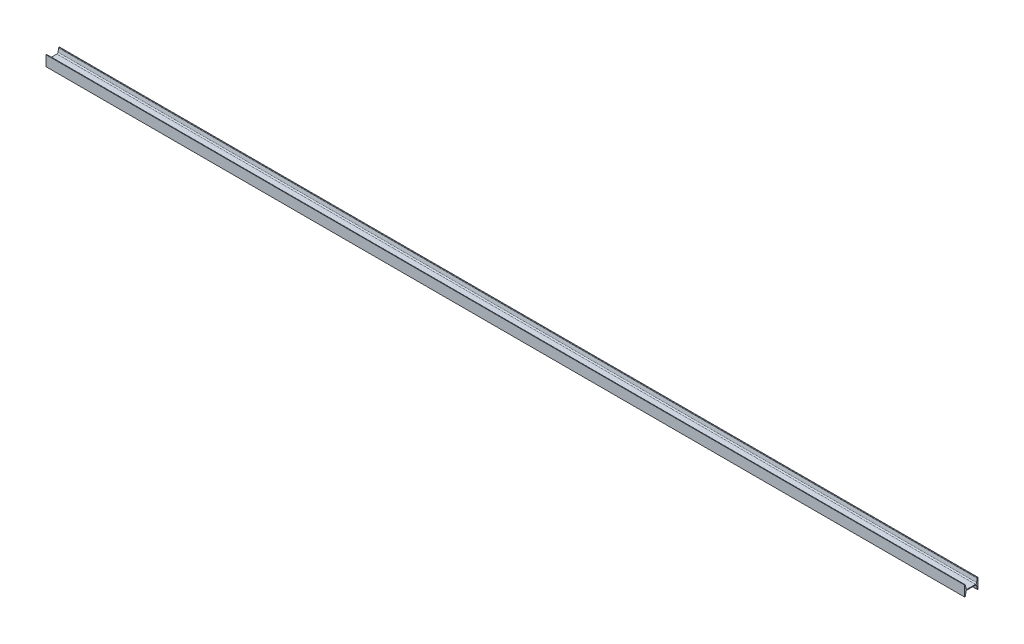
ISO-10303-21;
HEADER;
FILE_DESCRIPTION(('STEP AP214'),'2;1');
FILE_NAME('part.step','',(''),(''),'','','');
FILE_SCHEMA(('AUTOMOTIVE_DESIGN { 1 0 10303 214 1 1 1 1 }'));
ENDSEC;
DATA;
#1=APPLICATION_CONTEXT('core data for automotive mechanical design processes');
#2=APPLICATION_PROTOCOL_DEFINITION('international standard','automotive_design',2000,#1);
#3=PRODUCT_CONTEXT('',#1,'mechanical');
#4=PRODUCT('Part','Part','',(#3));
#5=PRODUCT_RELATED_PRODUCT_CATEGORY('part','',(#4));
#6=PRODUCT_DEFINITION_FORMATION('','',#4);
#7=PRODUCT_DEFINITION_CONTEXT('part definition',#1,'design');
#8=PRODUCT_DEFINITION('design','',#6,#7);
#9=PRODUCT_DEFINITION_SHAPE('','',#8);
#10=(LENGTH_UNIT() NAMED_UNIT(*) SI_UNIT(.MILLI.,.METRE.));
#11=(NAMED_UNIT(*) PLANE_ANGLE_UNIT() SI_UNIT($,.RADIAN.));
#12=(NAMED_UNIT(*) SI_UNIT($,.STERADIAN.) SOLID_ANGLE_UNIT());
#13=UNCERTAINTY_MEASURE_WITH_UNIT(LENGTH_MEASURE(1.E-05),#10,'distance_accuracy_value','');
#14=(GEOMETRIC_REPRESENTATION_CONTEXT(3) GLOBAL_UNCERTAINTY_ASSIGNED_CONTEXT((#13)) GLOBAL_UNIT_ASSIGNED_CONTEXT((#10,
#11,#12)) REPRESENTATION_CONTEXT('',''));
#15=CARTESIAN_POINT('',(0.,0.,0.));
#16=DIRECTION('',(0.,0.,1.));
#17=DIRECTION('',(1.,0.,0.));
#18=AXIS2_PLACEMENT_3D('',#15,#16,#17);
#19=CARTESIAN_POINT('',(3076.96600985222,136.72769950739,-38.1));
#20=DIRECTION('',(0.,0.,1.));
#21=DIRECTION('',(0.,-1.,0.));
#22=AXIS2_PLACEMENT_3D('',#19,#20,#21);
#23=PLANE('',#22);
#24=DIRECTION('',(0.,1.,0.));
#25=VECTOR('',#24,1.);
#26=CARTESIAN_POINT('',(-2142.73399014778,136.72769950739,-38.1));
#27=LINE('',#26,#25);
#28=CARTESIAN_POINT('',(-2142.73399014778,77.5456995073895,-38.1));
#29=VERTEX_POINT('',#28);
#30=CARTESIAN_POINT('',(-2142.73399014778,136.72769950739,-38.1));
#31=VERTEX_POINT('',#30);
#32=EDGE_CURVE('E268',#29,#31,#27,.T.);
#33=ORIENTED_EDGE('',*,*,#32,.T.);
#34=DIRECTION('',(-1.,0.,0.));
#35=VECTOR('',#34,1.);
#36=CARTESIAN_POINT('',(3076.96600985222,136.72769950739,-38.1));
#37=LINE('',#36,#35);
#38=CARTESIAN_POINT('',(3076.96600985222,136.72769950739,-38.1));
#39=VERTEX_POINT('',#38);
#40=EDGE_CURVE('E13',#39,#31,#37,.T.);
#41=ORIENTED_EDGE('',*,*,#40,.F.);
#42=DIRECTION('',(0.,1.,0.));
#43=VECTOR('',#42,1.);
#44=CARTESIAN_POINT('',(3076.96600985222,136.72769950739,-38.1));
#45=LINE('',#44,#43);
#46=CARTESIAN_POINT('',(3076.96600985222,77.5456995073895,-38.1));
#47=VERTEX_POINT('',#46);
#48=EDGE_CURVE('E306',#47,#39,#45,.T.);
#49=ORIENTED_EDGE('',*,*,#48,.F.);
#50=DIRECTION('',(-1.,0.,0.));
#51=VECTOR('',#50,1.);
#52=CARTESIAN_POINT('',(3076.96600985222,77.5456995073895,-38.1));
#53=LINE('',#52,#51);
#54=EDGE_CURVE('E264',#47,#29,#53,.T.);
#55=ORIENTED_EDGE('',*,*,#54,.T.);
#56=EDGE_LOOP('',(#33,#41,#49,#55));
#57=FACE_BOUND('',#56,.T.);
#58=ADVANCED_FACE('F100',(#57),#23,.F.);
#59=CARTESIAN_POINT('',(3076.96600985222,136.72769950739,-35.933843762969));
#60=DIRECTION('',(0.,-1.,0.));
#61=DIRECTION('',(0.,0.,-1.));
#62=AXIS2_PLACEMENT_3D('',#59,#60,#61);
#63=PLANE('',#62);
#64=DIRECTION('',(0.,0.,1.));
#65=VECTOR('',#64,1.);
#66=CARTESIAN_POINT('',(-2142.73399014778,136.72769950739,-35.933843762969));
#67=LINE('',#66,#65);
#68=CARTESIAN_POINT('',(-2142.73399014778,136.72769950739,-35.933843762969));
#69=VERTEX_POINT('',#68);
#70=EDGE_CURVE('E271',#31,#69,#67,.T.);
#71=ORIENTED_EDGE('',*,*,#70,.T.);
#72=DIRECTION('',(-1.,0.,0.));
#73=VECTOR('',#72,1.);
#74=CARTESIAN_POINT('',(3076.96600985222,136.72769950739,-35.933843762969));
#75=LINE('',#74,#73);
#76=CARTESIAN_POINT('',(3076.96600985222,136.72769950739,-35.933843762969));
#77=VERTEX_POINT('',#76);
#78=EDGE_CURVE('E108',#77,#69,#75,.T.);
#79=ORIENTED_EDGE('',*,*,#78,.F.);
#80=DIRECTION('',(0.,0.,1.));
#81=VECTOR('',#80,1.);
#82=CARTESIAN_POINT('',(3076.96600985222,136.72769950739,-35.933843762969));
#83=LINE('',#82,#81);
#84=EDGE_CURVE('E195',#39,#77,#83,.T.);
#85=ORIENTED_EDGE('',*,*,#84,.F.);
#86=ORIENTED_EDGE('',*,*,#40,.T.);
#87=EDGE_LOOP('',(#71,#79,#85,#86));
#88=FACE_BOUND('',#87,.T.);
#89=ADVANCED_FACE('F424',(#88),#63,.F.);
#90=CARTESIAN_POINT('',(3076.96600985222,134.18769950739,-35.9338437629689));
#91=DIRECTION('',(-1.,0.,0.));
#92=DIRECTION('',(0.,0.,1.));
#93=AXIS2_PLACEMENT_3D('',#90,#91,#92);
#94=CYLINDRICAL_SURFACE('',#93,2.54000000000001);
#95=CARTESIAN_POINT('',(-2142.73399014778,134.18769950739,-35.9338437629689));
#96=DIRECTION('',(1.,0.,0.));
#97=DIRECTION('',(0.,0.,-1.));
#98=AXIS2_PLACEMENT_3D('',#95,#96,#97);
#99=CIRCLE('',#98,2.54000000000001);
#100=CARTESIAN_POINT('',(-2142.73399014778,134.60530257373,-33.4284081363796));
#101=VERTEX_POINT('',#100);
#102=EDGE_CURVE('E273',#69,#101,#99,.T.);
#103=ORIENTED_EDGE('',*,*,#102,.T.);
#104=DIRECTION('',(-1.,0.,0.));
#105=VECTOR('',#104,1.);
#106=CARTESIAN_POINT('',(3076.96600985222,134.60530257373,-33.4284081363796));
#107=LINE('',#106,#105);
#108=CARTESIAN_POINT('',(3076.96600985222,134.60530257373,-33.4284081363796));
#109=VERTEX_POINT('',#108);
#110=EDGE_CURVE('E349',#109,#101,#107,.T.);
#111=ORIENTED_EDGE('',*,*,#110,.F.);
#112=CARTESIAN_POINT('',(3076.96600985222,134.18769950739,-35.9338437629689));
#113=DIRECTION('',(1.,0.,0.));
#114=DIRECTION('',(0.,0.,-1.));
#115=AXIS2_PLACEMENT_3D('',#112,#113,#114);
#116=CIRCLE('',#115,2.54000000000001);
#117=EDGE_CURVE('E357',#77,#109,#116,.T.);
#118=ORIENTED_EDGE('',*,*,#117,.F.);
#119=ORIENTED_EDGE('',*,*,#78,.T.);
#120=EDGE_LOOP('',(#103,#111,#118,#119));
#121=FACE_BOUND('',#120,.T.);
#122=ADVANCED_FACE('F355',(#121),#94,.T.);
#123=CARTESIAN_POINT('',(3076.96600985222,115.02617122827,-30.1649815292945));
#124=DIRECTION('',(0.,-0.164410656039623,-0.986391978972163));
#125=DIRECTION('',(0.,0.986391978972163,-0.164410656039623));
#126=AXIS2_PLACEMENT_3D('',#123,#124,#125);
#127=PLANE('',#126);
#128=DIRECTION('',(0.,-0.986391978972163,0.164410656039623));
#129=VECTOR('',#128,1.);
#130=CARTESIAN_POINT('',(-2142.73399014778,115.02617122827,-30.1649815292945));
#131=LINE('',#130,#129);
#132=CARTESIAN_POINT('',(-2142.73399014778,115.02617122827,-30.1649815292945));
#133=VERTEX_POINT('',#132);
#134=EDGE_CURVE('E275',#101,#133,#131,.T.);
#135=ORIENTED_EDGE('',*,*,#134,.T.);
#136=DIRECTION('',(-1.,0.,0.));
#137=VECTOR('',#136,1.);
#138=CARTESIAN_POINT('',(3076.96600985222,115.02617122827,-30.1649815292945));
#139=LINE('',#138,#137);
#140=CARTESIAN_POINT('',(3076.96600985222,115.02617122827,-30.1649815292945));
#141=VERTEX_POINT('',#140);
#142=EDGE_CURVE('E346',#141,#133,#139,.T.);
#143=ORIENTED_EDGE('',*,*,#142,.F.);
#144=DIRECTION('',(0.,-0.986391978972163,0.164410656039623));
#145=VECTOR('',#144,1.);
#146=CARTESIAN_POINT('',(3076.96600985222,115.02617122827,-30.1649815292945));
#147=LINE('',#146,#145);
#148=EDGE_CURVE('E375',#109,#141,#147,.T.);
#149=ORIENTED_EDGE('',*,*,#148,.F.);
#150=ORIENTED_EDGE('',*,*,#110,.T.);
#151=EDGE_LOOP('',(#135,#143,#149,#150));
#152=FACE_BOUND('',#151,.T.);
#153=ADVANCED_FACE('F366',(#152),#127,.F.);
#154=CARTESIAN_POINT('',(3076.96600985222,116.15369950739,-23.4003053375034));
#155=DIRECTION('',(-1.,0.,0.));
#156=DIRECTION('',(0.,0.,1.));
#157=AXIS2_PLACEMENT_3D('',#154,#155,#156);
#158=CYLINDRICAL_SURFACE('',#157,6.858);
#159=CARTESIAN_POINT('',(-2142.73399014778,116.15369950739,-23.4003053375034));
#160=DIRECTION('',(-1.,0.,0.));
#161=DIRECTION('',(0.,0.,-1.));
#162=AXIS2_PLACEMENT_3D('',#159,#160,#161);
#163=CIRCLE('',#162,6.858);
#164=CARTESIAN_POINT('',(-2142.73399014778,109.29569950739,-23.4003053375034));
#165=VERTEX_POINT('',#164);
#166=EDGE_CURVE('E277',#133,#165,#163,.T.);
#167=ORIENTED_EDGE('',*,*,#166,.T.);
#168=DIRECTION('',(-1.,0.,0.));
#169=VECTOR('',#168,1.);
#170=CARTESIAN_POINT('',(3076.96600985222,109.29569950739,-23.4003053375034));
#171=LINE('',#170,#169);
#172=CARTESIAN_POINT('',(3076.96600985222,109.29569950739,-23.4003053375034));
#173=VERTEX_POINT('',#172);
#174=EDGE_CURVE('E343',#173,#165,#171,.T.);
#175=ORIENTED_EDGE('',*,*,#174,.F.);
#176=CARTESIAN_POINT('',(3076.96600985222,116.15369950739,-23.4003053375034));
#177=DIRECTION('',(-1.,0.,0.));
#178=DIRECTION('',(0.,0.,-1.));
#179=AXIS2_PLACEMENT_3D('',#176,#177,#178);
#180=CIRCLE('',#179,6.858);
#181=EDGE_CURVE('E372',#141,#173,#180,.T.);
#182=ORIENTED_EDGE('',*,*,#181,.F.);
#183=ORIENTED_EDGE('',*,*,#142,.T.);
#184=EDGE_LOOP('',(#167,#175,#182,#183));
#185=FACE_BOUND('',#184,.T.);
#186=ADVANCED_FACE('F370',(#185),#158,.F.);
#187=CARTESIAN_POINT('',(3076.96600985222,109.29569950739,23.4003053375034));
#188=DIRECTION('',(0.,-1.,0.));
#189=DIRECTION('',(0.,0.,-1.));
#190=AXIS2_PLACEMENT_3D('',#187,#188,#189);
#191=PLANE('',#190);
#192=DIRECTION('',(0.,0.,1.));
#193=VECTOR('',#192,1.);
#194=CARTESIAN_POINT('',(-2142.73399014778,109.29569950739,23.4003053375034));
#195=LINE('',#194,#193);
#196=CARTESIAN_POINT('',(-2142.73399014778,109.29569950739,23.4003053375034));
#197=VERTEX_POINT('',#196);
#198=EDGE_CURVE('E279',#165,#197,#195,.T.);
#199=ORIENTED_EDGE('',*,*,#198,.T.);
#200=DIRECTION('',(-1.,0.,0.));
#201=VECTOR('',#200,1.);
#202=CARTESIAN_POINT('',(3076.96600985222,109.29569950739,23.4003053375034));
#203=LINE('',#202,#201);
#204=CARTESIAN_POINT('',(3076.96600985222,109.29569950739,23.4003053375034));
#205=VERTEX_POINT('',#204);
#206=EDGE_CURVE('E340',#205,#197,#203,.T.);
#207=ORIENTED_EDGE('',*,*,#206,.F.);
#208=DIRECTION('',(0.,0.,1.));
#209=VECTOR('',#208,1.);
#210=CARTESIAN_POINT('',(3076.96600985222,109.29569950739,23.4003053375034));
#211=LINE('',#210,#209);
#212=EDGE_CURVE('E374',#173,#205,#211,.T.);
#213=ORIENTED_EDGE('',*,*,#212,.F.);
#214=ORIENTED_EDGE('',*,*,#174,.T.);
#215=EDGE_LOOP('',(#199,#207,#213,#214));
#216=FACE_BOUND('',#215,.T.);
#217=ADVANCED_FACE('F437',(#216),#191,.F.);
#218=CARTESIAN_POINT('',(3076.96600985222,116.15369950739,23.4003053375034));
#219=DIRECTION('',(-1.,0.,0.));
#220=DIRECTION('',(0.,0.,1.));
#221=AXIS2_PLACEMENT_3D('',#218,#219,#220);
#222=CYLINDRICAL_SURFACE('',#221,6.858);
#223=CARTESIAN_POINT('',(-2142.73399014778,116.15369950739,23.4003053375034));
#224=DIRECTION('',(-1.,0.,0.));
#225=DIRECTION('',(0.,0.,-1.));
#226=AXIS2_PLACEMENT_3D('',#223,#224,#225);
#227=CIRCLE('',#226,6.858);
#228=CARTESIAN_POINT('',(-2142.73399014778,115.02617122827,30.1649815292945));
#229=VERTEX_POINT('',#228);
#230=EDGE_CURVE('E281',#197,#229,#227,.T.);
#231=ORIENTED_EDGE('',*,*,#230,.T.);
#232=DIRECTION('',(-1.,0.,0.));
#233=VECTOR('',#232,1.);
#234=CARTESIAN_POINT('',(3076.96600985222,115.02617122827,30.1649815292945));
#235=LINE('',#234,#233);
#236=CARTESIAN_POINT('',(3076.96600985222,115.02617122827,30.1649815292945));
#237=VERTEX_POINT('',#236);
#238=EDGE_CURVE('E337',#237,#229,#235,.T.);
#239=ORIENTED_EDGE('',*,*,#238,.F.);
#240=CARTESIAN_POINT('',(3076.96600985222,116.15369950739,23.4003053375034));
#241=DIRECTION('',(-1.,0.,0.));
#242=DIRECTION('',(0.,0.,-1.));
#243=AXIS2_PLACEMENT_3D('',#240,#241,#242);
#244=CIRCLE('',#243,6.858);
#245=EDGE_CURVE('E377',#205,#237,#244,.T.);
#246=ORIENTED_EDGE('',*,*,#245,.F.);
#247=ORIENTED_EDGE('',*,*,#206,.T.);
#248=EDGE_LOOP('',(#231,#239,#246,#247));
#249=FACE_BOUND('',#248,.T.);
#250=ADVANCED_FACE('F440',(#249),#222,.F.);
#251=CARTESIAN_POINT('',(3076.96600985222,134.60530257373,33.4284081363796));
#252=DIRECTION('',(0.,-0.164410656039623,0.986391978972163));
#253=DIRECTION('',(0.,-0.986391978972163,-0.164410656039623));
#254=AXIS2_PLACEMENT_3D('',#251,#252,#253);
#255=PLANE('',#254);
#256=DIRECTION('',(0.,0.986391978972163,0.164410656039623));
#257=VECTOR('',#256,1.);
#258=CARTESIAN_POINT('',(-2142.73399014778,134.60530257373,33.4284081363796));
#259=LINE('',#258,#257);
#260=CARTESIAN_POINT('',(-2142.73399014778,134.60530257373,33.4284081363796));
#261=VERTEX_POINT('',#260);
#262=EDGE_CURVE('E283',#229,#261,#259,.T.);
#263=ORIENTED_EDGE('',*,*,#262,.T.);
#264=DIRECTION('',(-1.,0.,0.));
#265=VECTOR('',#264,1.);
#266=CARTESIAN_POINT('',(3076.96600985222,134.60530257373,33.4284081363796));
#267=LINE('',#266,#265);
#268=CARTESIAN_POINT('',(3076.96600985222,134.60530257373,33.4284081363796));
#269=VERTEX_POINT('',#268);
#270=EDGE_CURVE('E334',#269,#261,#267,.T.);
#271=ORIENTED_EDGE('',*,*,#270,.F.);
#272=DIRECTION('',(0.,0.986391978972163,0.164410656039623));
#273=VECTOR('',#272,1.);
#274=CARTESIAN_POINT('',(3076.96600985222,134.60530257373,33.4284081363796));
#275=LINE('',#274,#273);
#276=EDGE_CURVE('E383',#237,#269,#275,.T.);
#277=ORIENTED_EDGE('',*,*,#276,.F.);
#278=ORIENTED_EDGE('',*,*,#238,.T.);
#279=EDGE_LOOP('',(#263,#271,#277,#278));
#280=FACE_BOUND('',#279,.T.);
#281=ADVANCED_FACE('F444',(#280),#255,.F.);
#282=CARTESIAN_POINT('',(3076.96600985222,134.18769950739,35.9338437629689));
#283=DIRECTION('',(-1.,0.,0.));
#284=DIRECTION('',(0.,0.,1.));
#285=AXIS2_PLACEMENT_3D('',#282,#283,#284);
#286=CYLINDRICAL_SURFACE('',#285,2.54000000000001);
#287=CARTESIAN_POINT('',(-2142.73399014778,134.18769950739,35.9338437629689));
#288=DIRECTION('',(1.,0.,0.));
#289=DIRECTION('',(0.,0.,-1.));
#290=AXIS2_PLACEMENT_3D('',#287,#288,#289);
#291=CIRCLE('',#290,2.54000000000001);
#292=CARTESIAN_POINT('',(-2142.73399014778,136.72769950739,35.9338437629689));
#293=VERTEX_POINT('',#292);
#294=EDGE_CURVE('E285',#261,#293,#291,.T.);
#295=ORIENTED_EDGE('',*,*,#294,.T.);
#296=DIRECTION('',(-1.,0.,0.));
#297=VECTOR('',#296,1.);
#298=CARTESIAN_POINT('',(3076.96600985222,136.72769950739,35.9338437629689));
#299=LINE('',#298,#297);
#300=CARTESIAN_POINT('',(3076.96600985222,136.72769950739,35.9338437629689));
#301=VERTEX_POINT('',#300);
#302=EDGE_CURVE('E331',#301,#293,#299,.T.);
#303=ORIENTED_EDGE('',*,*,#302,.F.);
#304=CARTESIAN_POINT('',(3076.96600985222,134.18769950739,35.9338437629689));
#305=DIRECTION('',(1.,0.,0.));
#306=DIRECTION('',(0.,0.,-1.));
#307=AXIS2_PLACEMENT_3D('',#304,#305,#306);
#308=CIRCLE('',#307,2.54000000000001);
#309=EDGE_CURVE('E385',#269,#301,#308,.T.);
#310=ORIENTED_EDGE('',*,*,#309,.F.);
#311=ORIENTED_EDGE('',*,*,#270,.T.);
#312=EDGE_LOOP('',(#295,#303,#310,#311));
#313=FACE_BOUND('',#312,.T.);
#314=ADVANCED_FACE('F448',(#313),#286,.T.);
#315=CARTESIAN_POINT('',(3076.96600985222,136.72769950739,38.1));
#316=DIRECTION('',(0.,-1.,0.));
#317=DIRECTION('',(0.,0.,-1.));
#318=AXIS2_PLACEMENT_3D('',#315,#316,#317);
#319=PLANE('',#318);
#320=DIRECTION('',(0.,0.,1.));
#321=VECTOR('',#320,1.);
#322=CARTESIAN_POINT('',(-2142.73399014778,136.72769950739,38.1));
#323=LINE('',#322,#321);
#324=CARTESIAN_POINT('',(-2142.73399014778,136.72769950739,38.1));
#325=VERTEX_POINT('',#324);
#326=EDGE_CURVE('E287',#293,#325,#323,.T.);
#327=ORIENTED_EDGE('',*,*,#326,.T.);
#328=DIRECTION('',(-1.,0.,0.));
#329=VECTOR('',#328,1.);
#330=CARTESIAN_POINT('',(3076.96600985222,136.72769950739,38.1));
#331=LINE('',#330,#329);
#332=CARTESIAN_POINT('',(3076.96600985222,136.72769950739,38.1));
#333=VERTEX_POINT('',#332);
#334=EDGE_CURVE('E328',#333,#325,#331,.T.);
#335=ORIENTED_EDGE('',*,*,#334,.F.);
#336=DIRECTION('',(0.,0.,1.));
#337=VECTOR('',#336,1.);
#338=CARTESIAN_POINT('',(3076.96600985222,136.72769950739,38.1));
#339=LINE('',#338,#337);
#340=EDGE_CURVE('E387',#301,#333,#339,.T.);
#341=ORIENTED_EDGE('',*,*,#340,.F.);
#342=ORIENTED_EDGE('',*,*,#302,.T.);
#343=EDGE_LOOP('',(#327,#335,#341,#342));
#344=FACE_BOUND('',#343,.T.);
#345=ADVANCED_FACE('F452',(#344),#319,.F.);
#346=CARTESIAN_POINT('',(3076.96600985222,77.5456995073895,38.1));
#347=DIRECTION('',(0.,0.,-1.));
#348=DIRECTION('',(0.,1.,0.));
#349=AXIS2_PLACEMENT_3D('',#346,#347,#348);
#350=PLANE('',#349);
#351=DIRECTION('',(0.,-1.,0.));
#352=VECTOR('',#351,1.);
#353=CARTESIAN_POINT('',(-2142.73399014778,77.5456995073895,38.1));
#354=LINE('',#353,#352);
#355=CARTESIAN_POINT('',(-2142.73399014778,77.5456995073895,38.1));
#356=VERTEX_POINT('',#355);
#357=EDGE_CURVE('E289',#325,#356,#354,.T.);
#358=ORIENTED_EDGE('',*,*,#357,.T.);
#359=DIRECTION('',(-1.,0.,0.));
#360=VECTOR('',#359,1.);
#361=CARTESIAN_POINT('',(3076.96600985222,77.5456995073895,38.1));
#362=LINE('',#361,#360);
#363=CARTESIAN_POINT('',(3076.96600985222,77.5456995073895,38.1));
#364=VERTEX_POINT('',#363);
#365=EDGE_CURVE('E325',#364,#356,#362,.T.);
#366=ORIENTED_EDGE('',*,*,#365,.F.);
#367=DIRECTION('',(0.,-1.,0.));
#368=VECTOR('',#367,1.);
#369=CARTESIAN_POINT('',(3076.96600985222,77.5456995073895,38.1));
#370=LINE('',#369,#368);
#371=EDGE_CURVE('E389',#333,#364,#370,.T.);
#372=ORIENTED_EDGE('',*,*,#371,.F.);
#373=ORIENTED_EDGE('',*,*,#334,.T.);
#374=EDGE_LOOP('',(#358,#366,#372,#373));
#375=FACE_BOUND('',#374,.T.);
#376=ADVANCED_FACE('F456',(#375),#350,.F.);
#377=CARTESIAN_POINT('',(3076.96600985222,77.5456995073895,35.9338437629689));
#378=DIRECTION('',(0.,1.,0.));
#379=DIRECTION('',(0.,0.,1.));
#380=AXIS2_PLACEMENT_3D('',#377,#378,#379);
#381=PLANE('',#380);
#382=DIRECTION('',(0.,0.,-1.));
#383=VECTOR('',#382,1.);
#384=CARTESIAN_POINT('',(-2142.73399014778,77.5456995073895,35.9338437629689));
#385=LINE('',#384,#383);
#386=CARTESIAN_POINT('',(-2142.73399014778,77.5456995073895,35.9338437629689));
#387=VERTEX_POINT('',#386);
#388=EDGE_CURVE('E291',#356,#387,#385,.T.);
#389=ORIENTED_EDGE('',*,*,#388,.T.);
#390=DIRECTION('',(-1.,0.,0.));
#391=VECTOR('',#390,1.);
#392=CARTESIAN_POINT('',(3076.96600985222,77.5456995073895,35.9338437629689));
#393=LINE('',#392,#391);
#394=CARTESIAN_POINT('',(3076.96600985222,77.5456995073895,35.9338437629689));
#395=VERTEX_POINT('',#394);
#396=EDGE_CURVE('E322',#395,#387,#393,.T.);
#397=ORIENTED_EDGE('',*,*,#396,.F.);
#398=DIRECTION('',(0.,0.,-1.));
#399=VECTOR('',#398,1.);
#400=CARTESIAN_POINT('',(3076.96600985222,77.5456995073895,35.9338437629689));
#401=LINE('',#400,#399);
#402=EDGE_CURVE('E391',#364,#395,#401,.T.);
#403=ORIENTED_EDGE('',*,*,#402,.F.);
#404=ORIENTED_EDGE('',*,*,#365,.T.);
#405=EDGE_LOOP('',(#389,#397,#403,#404));
#406=FACE_BOUND('',#405,.T.);
#407=ADVANCED_FACE('F460',(#406),#381,.F.);
#408=CARTESIAN_POINT('',(3076.96600985222,80.0856995073895,35.9338437629689));
#409=DIRECTION('',(-1.,0.,0.));
#410=DIRECTION('',(0.,0.,1.));
#411=AXIS2_PLACEMENT_3D('',#408,#409,#410);
#412=CYLINDRICAL_SURFACE('',#411,2.54);
#413=CARTESIAN_POINT('',(-2142.73399014778,80.0856995073895,35.9338437629689));
#414=DIRECTION('',(1.,0.,0.));
#415=DIRECTION('',(0.,0.,1.));
#416=AXIS2_PLACEMENT_3D('',#413,#414,#415);
#417=CIRCLE('',#416,2.54);
#418=CARTESIAN_POINT('',(-2142.73399014778,79.6680964410489,33.4284081363796));
#419=VERTEX_POINT('',#418);
#420=EDGE_CURVE('E293',#387,#419,#417,.T.);
#421=ORIENTED_EDGE('',*,*,#420,.T.);
#422=DIRECTION('',(-1.,0.,0.));
#423=VECTOR('',#422,1.);
#424=CARTESIAN_POINT('',(3076.96600985222,79.6680964410489,33.4284081363796));
#425=LINE('',#424,#423);
#426=CARTESIAN_POINT('',(3076.96600985222,79.6680964410489,33.4284081363796));
#427=VERTEX_POINT('',#426);
#428=EDGE_CURVE('E319',#427,#419,#425,.T.);
#429=ORIENTED_EDGE('',*,*,#428,.F.);
#430=CARTESIAN_POINT('',(3076.96600985222,80.0856995073895,35.9338437629689));
#431=DIRECTION('',(1.,0.,0.));
#432=DIRECTION('',(0.,0.,1.));
#433=AXIS2_PLACEMENT_3D('',#430,#431,#432);
#434=CIRCLE('',#433,2.54);
#435=EDGE_CURVE('E393',#395,#427,#434,.T.);
#436=ORIENTED_EDGE('',*,*,#435,.F.);
#437=ORIENTED_EDGE('',*,*,#396,.T.);
#438=EDGE_LOOP('',(#421,#429,#436,#437));
#439=FACE_BOUND('',#438,.T.);
#440=ADVANCED_FACE('F464',(#439),#412,.T.);
#441=CARTESIAN_POINT('',(3076.96600985222,99.2472277865093,30.1649815292945));
#442=DIRECTION('',(0.,0.164410656039623,0.986391978972163));
#443=DIRECTION('',(0.,-0.986391978972163,0.164410656039623));
#444=AXIS2_PLACEMENT_3D('',#441,#442,#443);
#445=PLANE('',#444);
#446=DIRECTION('',(0.,0.986391978972163,-0.164410656039623));
#447=VECTOR('',#446,1.);
#448=CARTESIAN_POINT('',(-2142.73399014778,99.2472277865093,30.1649815292945));
#449=LINE('',#448,#447);
#450=CARTESIAN_POINT('',(-2142.73399014778,99.2472277865093,30.1649815292945));
#451=VERTEX_POINT('',#450);
#452=EDGE_CURVE('E295',#419,#451,#449,.T.);
#453=ORIENTED_EDGE('',*,*,#452,.T.);
#454=DIRECTION('',(-1.,0.,0.));
#455=VECTOR('',#454,1.);
#456=CARTESIAN_POINT('',(3076.96600985222,99.2472277865093,30.1649815292945));
#457=LINE('',#456,#455);
#458=CARTESIAN_POINT('',(3076.96600985222,99.2472277865093,30.1649815292945));
#459=VERTEX_POINT('',#458);
#460=EDGE_CURVE('E316',#459,#451,#457,.T.);
#461=ORIENTED_EDGE('',*,*,#460,.F.);
#462=DIRECTION('',(0.,0.986391978972163,-0.164410656039623));
#463=VECTOR('',#462,1.);
#464=CARTESIAN_POINT('',(3076.96600985222,99.2472277865093,30.1649815292945));
#465=LINE('',#464,#463);
#466=EDGE_CURVE('E395',#427,#459,#465,.T.);
#467=ORIENTED_EDGE('',*,*,#466,.F.);
#468=ORIENTED_EDGE('',*,*,#428,.T.);
#469=EDGE_LOOP('',(#453,#461,#467,#468));
#470=FACE_BOUND('',#469,.T.);
#471=ADVANCED_FACE('F468',(#470),#445,.F.);
#472=CARTESIAN_POINT('',(3076.96600985222,98.1196995073895,23.4003053375034));
#473=DIRECTION('',(-1.,0.,0.));
#474=DIRECTION('',(0.,0.,1.));
#475=AXIS2_PLACEMENT_3D('',#472,#473,#474);
#476=CYLINDRICAL_SURFACE('',#475,6.85799999999999);
#477=CARTESIAN_POINT('',(-2142.73399014778,98.1196995073895,23.4003053375034));
#478=DIRECTION('',(-1.,0.,0.));
#479=DIRECTION('',(0.,0.,-1.));
#480=AXIS2_PLACEMENT_3D('',#477,#478,#479);
#481=CIRCLE('',#480,6.85799999999999);
#482=CARTESIAN_POINT('',(-2142.73399014778,104.97769950739,23.4003053375034));
#483=VERTEX_POINT('',#482);
#484=EDGE_CURVE('E297',#451,#483,#481,.T.);
#485=ORIENTED_EDGE('',*,*,#484,.T.);
#486=DIRECTION('',(-1.,0.,0.));
#487=VECTOR('',#486,1.);
#488=CARTESIAN_POINT('',(3076.96600985222,104.97769950739,23.4003053375034));
#489=LINE('',#488,#487);
#490=CARTESIAN_POINT('',(3076.96600985222,104.97769950739,23.4003053375034));
#491=VERTEX_POINT('',#490);
#492=EDGE_CURVE('E313',#491,#483,#489,.T.);
#493=ORIENTED_EDGE('',*,*,#492,.F.);
#494=CARTESIAN_POINT('',(3076.96600985222,98.1196995073895,23.4003053375034));
#495=DIRECTION('',(-1.,0.,0.));
#496=DIRECTION('',(0.,0.,-1.));
#497=AXIS2_PLACEMENT_3D('',#494,#495,#496);
#498=CIRCLE('',#497,6.85799999999999);
#499=EDGE_CURVE('E397',#459,#491,#498,.T.);
#500=ORIENTED_EDGE('',*,*,#499,.F.);
#501=ORIENTED_EDGE('',*,*,#460,.T.);
#502=EDGE_LOOP('',(#485,#493,#500,#501));
#503=FACE_BOUND('',#502,.T.);
#504=ADVANCED_FACE('F472',(#503),#476,.F.);
#505=CARTESIAN_POINT('',(3076.96600985222,104.97769950739,-23.4003053375034));
#506=DIRECTION('',(0.,1.,0.));
#507=DIRECTION('',(0.,0.,1.));
#508=AXIS2_PLACEMENT_3D('',#505,#506,#507);
#509=PLANE('',#508);
#510=DIRECTION('',(0.,0.,-1.));
#511=VECTOR('',#510,1.);
#512=CARTESIAN_POINT('',(-2142.73399014778,104.97769950739,-23.4003053375034));
#513=LINE('',#512,#511);
#514=CARTESIAN_POINT('',(-2142.73399014778,104.97769950739,-23.4003053375034));
#515=VERTEX_POINT('',#514);
#516=EDGE_CURVE('E299',#483,#515,#513,.T.);
#517=ORIENTED_EDGE('',*,*,#516,.T.);
#518=DIRECTION('',(-1.,0.,0.));
#519=VECTOR('',#518,1.);
#520=CARTESIAN_POINT('',(3076.96600985222,104.97769950739,-23.4003053375034));
#521=LINE('',#520,#519);
#522=CARTESIAN_POINT('',(3076.96600985222,104.97769950739,-23.4003053375034));
#523=VERTEX_POINT('',#522);
#524=EDGE_CURVE('E310',#523,#515,#521,.T.);
#525=ORIENTED_EDGE('',*,*,#524,.F.);
#526=DIRECTION('',(0.,0.,-1.));
#527=VECTOR('',#526,1.);
#528=CARTESIAN_POINT('',(3076.96600985222,104.97769950739,-23.4003053375034));
#529=LINE('',#528,#527);
#530=EDGE_CURVE('E399',#491,#523,#529,.T.);
#531=ORIENTED_EDGE('',*,*,#530,.F.);
#532=ORIENTED_EDGE('',*,*,#492,.T.);
#533=EDGE_LOOP('',(#517,#525,#531,#532));
#534=FACE_BOUND('',#533,.T.);
#535=ADVANCED_FACE('F405',(#534),#509,.F.);
#536=CARTESIAN_POINT('',(3076.96600985222,98.1196995073895,-23.4003053375034));
#537=DIRECTION('',(-1.,0.,0.));
#538=DIRECTION('',(0.,0.,1.));
#539=AXIS2_PLACEMENT_3D('',#536,#537,#538);
#540=CYLINDRICAL_SURFACE('',#539,6.85799999999999);
#541=CARTESIAN_POINT('',(-2142.73399014778,98.1196995073895,-23.4003053375034));
#542=DIRECTION('',(-1.,0.,0.));
#543=DIRECTION('',(0.,0.,-1.));
#544=AXIS2_PLACEMENT_3D('',#541,#542,#543);
#545=CIRCLE('',#544,6.85799999999999);
#546=CARTESIAN_POINT('',(-2142.73399014778,99.2472277865093,-30.1649815292945));
#547=VERTEX_POINT('',#546);
#548=EDGE_CURVE('E301',#515,#547,#545,.T.);
#549=ORIENTED_EDGE('',*,*,#548,.T.);
#550=DIRECTION('',(-1.,0.,0.));
#551=VECTOR('',#550,1.);
#552=CARTESIAN_POINT('',(3076.96600985222,99.2472277865093,-30.1649815292945));
#553=LINE('',#552,#551);
#554=CARTESIAN_POINT('',(3076.96600985222,99.2472277865093,-30.1649815292945));
#555=VERTEX_POINT('',#554);
#556=EDGE_CURVE('E259',#555,#547,#553,.T.);
#557=ORIENTED_EDGE('',*,*,#556,.F.);
#558=CARTESIAN_POINT('',(3076.96600985222,98.1196995073895,-23.4003053375034));
#559=DIRECTION('',(-1.,0.,0.));
#560=DIRECTION('',(0.,0.,-1.));
#561=AXIS2_PLACEMENT_3D('',#558,#559,#560);
#562=CIRCLE('',#561,6.85799999999999);
#563=EDGE_CURVE('E250',#523,#555,#562,.T.);
#564=ORIENTED_EDGE('',*,*,#563,.F.);
#565=ORIENTED_EDGE('',*,*,#524,.T.);
#566=EDGE_LOOP('',(#549,#557,#564,#565));
#567=FACE_BOUND('',#566,.T.);
#568=ADVANCED_FACE('F409',(#567),#540,.F.);
#569=CARTESIAN_POINT('',(3076.96600985222,79.6680964410489,-33.4284081363796));
#570=DIRECTION('',(0.,0.164410656039623,-0.986391978972163));
#571=DIRECTION('',(0.,0.986391978972163,0.164410656039623));
#572=AXIS2_PLACEMENT_3D('',#569,#570,#571);
#573=PLANE('',#572);
#574=DIRECTION('',(0.,-0.986391978972163,-0.164410656039623));
#575=VECTOR('',#574,1.);
#576=CARTESIAN_POINT('',(-2142.73399014778,79.6680964410489,-33.4284081363796));
#577=LINE('',#576,#575);
#578=CARTESIAN_POINT('',(-2142.73399014778,79.6680964410489,-33.4284081363796));
#579=VERTEX_POINT('',#578);
#580=EDGE_CURVE('E258',#547,#579,#577,.T.);
#581=ORIENTED_EDGE('',*,*,#580,.T.);
#582=DIRECTION('',(-1.,0.,0.));
#583=VECTOR('',#582,1.);
#584=CARTESIAN_POINT('',(3076.96600985222,79.6680964410489,-33.4284081363796));
#585=LINE('',#584,#583);
#586=CARTESIAN_POINT('',(3076.96600985222,79.6680964410489,-33.4284081363796));
#587=VERTEX_POINT('',#586);
#588=EDGE_CURVE('E255',#587,#579,#585,.T.);
#589=ORIENTED_EDGE('',*,*,#588,.F.);
#590=DIRECTION('',(0.,-0.986391978972163,-0.164410656039623));
#591=VECTOR('',#590,1.);
#592=CARTESIAN_POINT('',(3076.96600985222,79.6680964410489,-33.4284081363796));
#593=LINE('',#592,#591);
#594=EDGE_CURVE('E244',#555,#587,#593,.T.);
#595=ORIENTED_EDGE('',*,*,#594,.F.);
#596=ORIENTED_EDGE('',*,*,#556,.T.);
#597=EDGE_LOOP('',(#581,#589,#595,#596));
#598=FACE_BOUND('',#597,.T.);
#599=ADVANCED_FACE('F256',(#598),#573,.F.);
#600=CARTESIAN_POINT('',(3076.96600985222,80.0856995073895,-35.9338437629689));
#601=DIRECTION('',(-1.,0.,0.));
#602=DIRECTION('',(0.,0.,1.));
#603=AXIS2_PLACEMENT_3D('',#600,#601,#602);
#604=CYLINDRICAL_SURFACE('',#603,2.54);
#605=CARTESIAN_POINT('',(-2142.73399014778,80.0856995073895,-35.9338437629689));
#606=DIRECTION('',(1.,0.,0.));
#607=DIRECTION('',(0.,0.,1.));
#608=AXIS2_PLACEMENT_3D('',#605,#606,#607);
#609=CIRCLE('',#608,2.54);
#610=CARTESIAN_POINT('',(-2142.73399014778,77.5456995073895,-35.9338437629689));
#611=VERTEX_POINT('',#610);
#612=EDGE_CURVE('E181',#579,#611,#609,.T.);
#613=ORIENTED_EDGE('',*,*,#612,.T.);
#614=DIRECTION('',(-1.,0.,0.));
#615=VECTOR('',#614,1.);
#616=CARTESIAN_POINT('',(3076.96600985222,77.5456995073895,-35.9338437629689));
#617=LINE('',#616,#615);
#618=CARTESIAN_POINT('',(3076.96600985222,77.5456995073895,-35.9338437629689));
#619=VERTEX_POINT('',#618);
#620=EDGE_CURVE('E260',#619,#611,#617,.T.);
#621=ORIENTED_EDGE('',*,*,#620,.F.);
#622=CARTESIAN_POINT('',(3076.96600985222,80.0856995073895,-35.9338437629689));
#623=DIRECTION('',(1.,0.,0.));
#624=DIRECTION('',(0.,0.,1.));
#625=AXIS2_PLACEMENT_3D('',#622,#623,#624);
#626=CIRCLE('',#625,2.54);
#627=EDGE_CURVE('E248',#587,#619,#626,.T.);
#628=ORIENTED_EDGE('',*,*,#627,.F.);
#629=ORIENTED_EDGE('',*,*,#588,.T.);
#630=EDGE_LOOP('',(#613,#621,#628,#629));
#631=FACE_BOUND('',#630,.T.);
#632=ADVANCED_FACE('F262',(#631),#604,.T.);
#633=CARTESIAN_POINT('',(3076.96600985222,77.5456995073895,-38.1));
#634=DIRECTION('',(0.,1.,0.));
#635=DIRECTION('',(0.,0.,1.));
#636=AXIS2_PLACEMENT_3D('',#633,#634,#635);
#637=PLANE('',#636);
#638=DIRECTION('',(0.,0.,-1.));
#639=VECTOR('',#638,1.);
#640=CARTESIAN_POINT('',(-2142.73399014778,77.5456995073895,-38.1));
#641=LINE('',#640,#639);
#642=EDGE_CURVE('E187',#611,#29,#641,.T.);
#643=ORIENTED_EDGE('',*,*,#642,.T.);
#644=ORIENTED_EDGE('',*,*,#54,.F.);
#645=DIRECTION('',(0.,0.,-1.));
#646=VECTOR('',#645,1.);
#647=CARTESIAN_POINT('',(3076.96600985222,77.5456995073895,-38.1));
#648=LINE('',#647,#646);
#649=EDGE_CURVE('E116',#619,#47,#648,.T.);
#650=ORIENTED_EDGE('',*,*,#649,.F.);
#651=ORIENTED_EDGE('',*,*,#620,.T.);
#652=EDGE_LOOP('',(#643,#644,#650,#651));
#653=FACE_BOUND('',#652,.T.);
#654=ADVANCED_FACE('F413',(#653),#637,.F.);
#655=CARTESIAN_POINT('',(3076.96600985222,80.0856995073895,-35.9338437629689));
#656=DIRECTION('',(-1.,0.,0.));
#657=DIRECTION('',(0.,0.,1.));
#658=AXIS2_PLACEMENT_3D('',#655,#656,#657);
#659=PLANE('',#658);
#660=ORIENTED_EDGE('',*,*,#48,.T.);
#661=ORIENTED_EDGE('',*,*,#84,.T.);
#662=ORIENTED_EDGE('',*,*,#117,.T.);
#663=ORIENTED_EDGE('',*,*,#148,.T.);
#664=ORIENTED_EDGE('',*,*,#181,.T.);
#665=ORIENTED_EDGE('',*,*,#212,.T.);
#666=ORIENTED_EDGE('',*,*,#245,.T.);
#667=ORIENTED_EDGE('',*,*,#276,.T.);
#668=ORIENTED_EDGE('',*,*,#309,.T.);
#669=ORIENTED_EDGE('',*,*,#340,.T.);
#670=ORIENTED_EDGE('',*,*,#371,.T.);
#671=ORIENTED_EDGE('',*,*,#402,.T.);
#672=ORIENTED_EDGE('',*,*,#435,.T.);
#673=ORIENTED_EDGE('',*,*,#466,.T.);
#674=ORIENTED_EDGE('',*,*,#499,.T.);
#675=ORIENTED_EDGE('',*,*,#530,.T.);
#676=ORIENTED_EDGE('',*,*,#563,.T.);
#677=ORIENTED_EDGE('',*,*,#594,.T.);
#678=ORIENTED_EDGE('',*,*,#627,.T.);
#679=ORIENTED_EDGE('',*,*,#649,.T.);
#680=EDGE_LOOP('',(#660,#661,#662,#663,#664,#665,#666,#667,#668,#669,#670,#671,#672,#673,#674,
#675,#676,#677,#678,#679));
#681=FACE_BOUND('',#680,.T.);
#682=ADVANCED_FACE('F246',(#681),#659,.F.);
#683=CARTESIAN_POINT('',(-2142.73399014778,80.0856995073895,-35.9338437629689));
#684=DIRECTION('',(-1.,0.,0.));
#685=DIRECTION('',(0.,0.,1.));
#686=AXIS2_PLACEMENT_3D('',#683,#684,#685);
#687=PLANE('',#686);
#688=ORIENTED_EDGE('',*,*,#32,.F.);
#689=ORIENTED_EDGE('',*,*,#642,.F.);
#690=ORIENTED_EDGE('',*,*,#612,.F.);
#691=ORIENTED_EDGE('',*,*,#580,.F.);
#692=ORIENTED_EDGE('',*,*,#548,.F.);
#693=ORIENTED_EDGE('',*,*,#516,.F.);
#694=ORIENTED_EDGE('',*,*,#484,.F.);
#695=ORIENTED_EDGE('',*,*,#452,.F.);
#696=ORIENTED_EDGE('',*,*,#420,.F.);
#697=ORIENTED_EDGE('',*,*,#388,.F.);
#698=ORIENTED_EDGE('',*,*,#357,.F.);
#699=ORIENTED_EDGE('',*,*,#326,.F.);
#700=ORIENTED_EDGE('',*,*,#294,.F.);
#701=ORIENTED_EDGE('',*,*,#262,.F.);
#702=ORIENTED_EDGE('',*,*,#230,.F.);
#703=ORIENTED_EDGE('',*,*,#198,.F.);
#704=ORIENTED_EDGE('',*,*,#166,.F.);
#705=ORIENTED_EDGE('',*,*,#134,.F.);
#706=ORIENTED_EDGE('',*,*,#102,.F.);
#707=ORIENTED_EDGE('',*,*,#70,.F.);
#708=EDGE_LOOP('',(#688,#689,#690,#691,#692,#693,#694,#695,#696,#697,#698,#699,#700,#701,#702,
#703,#704,#705,#706,#707));
#709=FACE_BOUND('',#708,.T.);
#710=ADVANCED_FACE('F361',(#709),#687,.T.);
#711=CLOSED_SHELL('',(#58,#89,#122,#153,#186,#217,#250,#281,#314,#345,#376,#407,#440,#471,#504,
#535,#568,#599,#632,#654,#682,#710));
#712=MANIFOLD_SOLID_BREP('B2',#711);
#713=ADVANCED_BREP_SHAPE_REPRESENTATION('',(#18,#712),#14);
#714=SHAPE_DEFINITION_REPRESENTATION(#9,#713);
ENDSEC;
END-ISO-10303-21;
